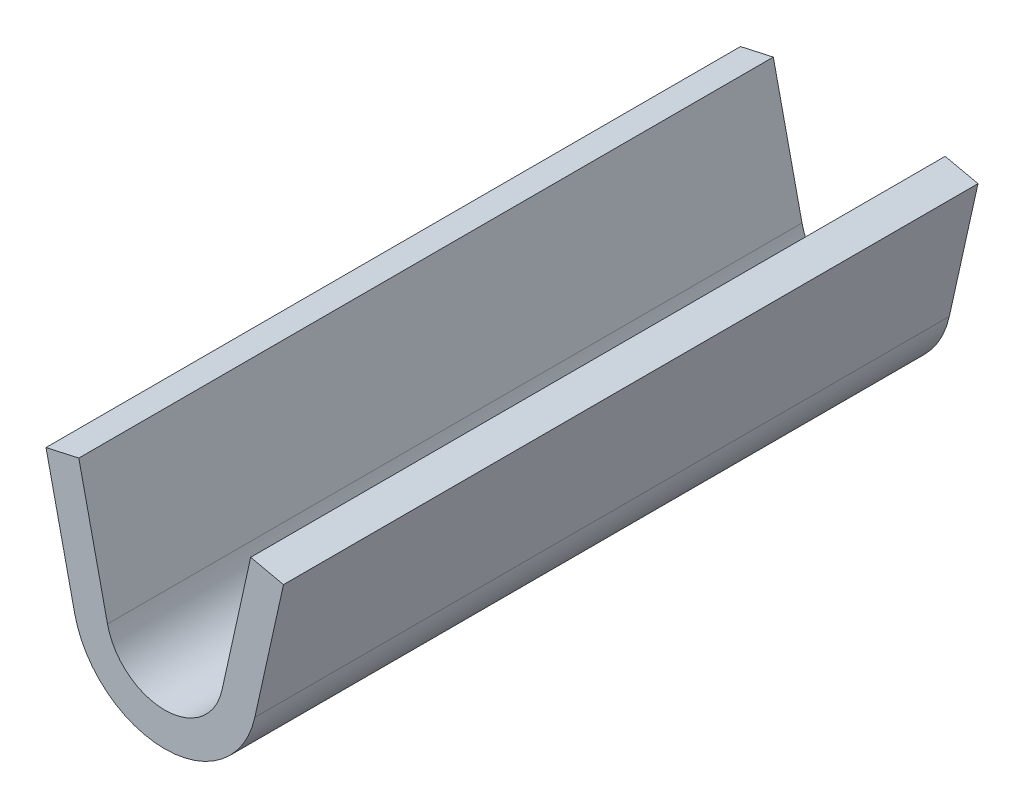
ISO-10303-21;
HEADER;
FILE_DESCRIPTION(('STEP AP214'),'2;1');
FILE_NAME('part.step','',(''),(''),'','','');
FILE_SCHEMA(('AUTOMOTIVE_DESIGN { 1 0 10303 214 1 1 1 1 }'));
ENDSEC;
DATA;
#1=APPLICATION_CONTEXT('core data for automotive mechanical design processes');
#2=APPLICATION_PROTOCOL_DEFINITION('international standard','automotive_design',2000,#1);
#3=PRODUCT_CONTEXT('',#1,'mechanical');
#4=PRODUCT('Part','Part','',(#3));
#5=PRODUCT_RELATED_PRODUCT_CATEGORY('part','',(#4));
#6=PRODUCT_DEFINITION_FORMATION('','',#4);
#7=PRODUCT_DEFINITION_CONTEXT('part definition',#1,'design');
#8=PRODUCT_DEFINITION('design','',#6,#7);
#9=PRODUCT_DEFINITION_SHAPE('','',#8);
#10=(LENGTH_UNIT() NAMED_UNIT(*) SI_UNIT(.MILLI.,.METRE.));
#11=(NAMED_UNIT(*) PLANE_ANGLE_UNIT() SI_UNIT($,.RADIAN.));
#12=(NAMED_UNIT(*) SI_UNIT($,.STERADIAN.) SOLID_ANGLE_UNIT());
#13=UNCERTAINTY_MEASURE_WITH_UNIT(LENGTH_MEASURE(1.E-05),#10,'distance_accuracy_value','');
#14=(GEOMETRIC_REPRESENTATION_CONTEXT(3) GLOBAL_UNCERTAINTY_ASSIGNED_CONTEXT((#13)) GLOBAL_UNIT_ASSIGNED_CONTEXT((#10,
#11,#12)) REPRESENTATION_CONTEXT('',''));
#15=CARTESIAN_POINT('',(0.,0.,0.));
#16=DIRECTION('',(0.,0.,1.));
#17=DIRECTION('',(1.,0.,0.));
#18=AXIS2_PLACEMENT_3D('',#15,#16,#17);
#19=CARTESIAN_POINT('',(-0.255558241465443,-0.0566558981273034,3.1));
#20=DIRECTION('',(-0.976296007119934,-0.216439613938099,0.));
#21=DIRECTION('',(0.216439613938099,-0.976296007119934,0.));
#22=AXIS2_PLACEMENT_3D('',#19,#20,#21);
#23=PLANE('',#22);
#24=DIRECTION('',(-0.216439613938099,0.976296007119934,0.));
#25=VECTOR('',#24,1.);
#26=CARTESIAN_POINT('',(-0.255558241465443,-0.0566558981273034,0.));
#27=LINE('',#26,#25);
#28=CARTESIAN_POINT('',(-0.255558241465443,-0.0566558981273034,0.));
#29=VERTEX_POINT('',#28);
#30=CARTESIAN_POINT('',(-0.38355559893201,0.520702870643421,0.));
#31=VERTEX_POINT('',#30);
#32=EDGE_CURVE('E131',#29,#31,#27,.T.);
#33=ORIENTED_EDGE('',*,*,#32,.T.);
#34=DIRECTION('',(0.,0.,-1.));
#35=VECTOR('',#34,1.);
#36=CARTESIAN_POINT('',(-0.38355559893201,0.520702870643421,3.1));
#37=LINE('',#36,#35);
#38=CARTESIAN_POINT('',(-0.38355559893201,0.520702870643421,3.1));
#39=VERTEX_POINT('',#38);
#40=EDGE_CURVE('E11',#39,#31,#37,.T.);
#41=ORIENTED_EDGE('',*,*,#40,.F.);
#42=DIRECTION('',(-0.216439613938099,0.976296007119934,0.));
#43=VECTOR('',#42,1.);
#44=CARTESIAN_POINT('',(-0.255558241465443,-0.0566558981273034,3.1));
#45=LINE('',#44,#43);
#46=CARTESIAN_POINT('',(-0.255558241465443,-0.0566558981273034,3.1));
#47=VERTEX_POINT('',#46);
#48=EDGE_CURVE('E89',#47,#39,#45,.T.);
#49=ORIENTED_EDGE('',*,*,#48,.F.);
#50=DIRECTION('',(0.,0.,-1.));
#51=VECTOR('',#50,1.);
#52=CARTESIAN_POINT('',(-0.255558241465443,-0.0566558981273034,3.1));
#53=LINE('',#52,#51);
#54=EDGE_CURVE('E130',#47,#29,#53,.T.);
#55=ORIENTED_EDGE('',*,*,#54,.T.);
#56=EDGE_LOOP('',(#33,#41,#49,#55));
#57=FACE_BOUND('',#56,.T.);
#58=ADVANCED_FACE('F34',(#57),#23,.F.);
#59=CARTESIAN_POINT('',(-0.53,0.488236928552706,3.1));
#60=DIRECTION('',(-0.216439613938099,0.976296007119934,0.));
#61=DIRECTION('',(-0.976296007119934,-0.216439613938099,0.));
#62=AXIS2_PLACEMENT_3D('',#59,#60,#61);
#63=PLANE('',#62);
#64=DIRECTION('',(0.976296007119934,0.216439613938099,0.));
#65=VECTOR('',#64,1.);
#66=CARTESIAN_POINT('',(-0.53,0.488236928552706,0.));
#67=LINE('',#66,#65);
#68=CARTESIAN_POINT('',(-0.53,0.488236928552706,0.));
#69=VERTEX_POINT('',#68);
#70=EDGE_CURVE('E134',#69,#31,#67,.T.);
#71=ORIENTED_EDGE('',*,*,#70,.F.);
#72=DIRECTION('',(0.,0.,-1.));
#73=VECTOR('',#72,1.);
#74=CARTESIAN_POINT('',(-0.53,0.488236928552706,3.1));
#75=LINE('',#74,#73);
#76=CARTESIAN_POINT('',(-0.53,0.488236928552706,3.1));
#77=VERTEX_POINT('',#76);
#78=EDGE_CURVE('E42',#77,#69,#75,.T.);
#79=ORIENTED_EDGE('',*,*,#78,.F.);
#80=DIRECTION('',(0.976296007119934,0.216439613938099,0.));
#81=VECTOR('',#80,1.);
#82=CARTESIAN_POINT('',(-0.53,0.488236928552706,3.1));
#83=LINE('',#82,#81);
#84=EDGE_CURVE('E173',#77,#39,#83,.T.);
#85=ORIENTED_EDGE('',*,*,#84,.T.);
#86=ORIENTED_EDGE('',*,*,#40,.T.);
#87=EDGE_LOOP('',(#71,#79,#85,#86));
#88=FACE_BOUND('',#87,.T.);
#89=ADVANCED_FACE('F164',(#88),#63,.T.);
#90=CARTESIAN_POINT('',(-0.402002642533433,-0.0891218402180183,3.1));
#91=DIRECTION('',(-0.976296007119934,-0.216439613938099,0.));
#92=DIRECTION('',(0.216439613938099,-0.976296007119934,0.));
#93=AXIS2_PLACEMENT_3D('',#90,#91,#92);
#94=PLANE('',#93);
#95=DIRECTION('',(-0.216439613938099,0.976296007119934,0.));
#96=VECTOR('',#95,1.);
#97=CARTESIAN_POINT('',(-0.402002642533433,-0.0891218402180183,0.));
#98=LINE('',#97,#96);
#99=CARTESIAN_POINT('',(-0.402002642533433,-0.0891218402180184,0.));
#100=VERTEX_POINT('',#99);
#101=EDGE_CURVE('E137',#100,#69,#98,.T.);
#102=ORIENTED_EDGE('',*,*,#101,.F.);
#103=DIRECTION('',(0.,0.,-1.));
#104=VECTOR('',#103,1.);
#105=CARTESIAN_POINT('',(-0.402002642533433,-0.0891218402180184,3.1));
#106=LINE('',#105,#104);
#107=CARTESIAN_POINT('',(-0.402002642533433,-0.0891218402180184,3.1));
#108=VERTEX_POINT('',#107);
#109=EDGE_CURVE('E154',#108,#100,#106,.T.);
#110=ORIENTED_EDGE('',*,*,#109,.F.);
#111=DIRECTION('',(-0.216439613938099,0.976296007119934,0.));
#112=VECTOR('',#111,1.);
#113=CARTESIAN_POINT('',(-0.402002642533433,-0.0891218402180183,3.1));
#114=LINE('',#113,#112);
#115=EDGE_CURVE('E161',#108,#77,#114,.T.);
#116=ORIENTED_EDGE('',*,*,#115,.T.);
#117=ORIENTED_EDGE('',*,*,#78,.T.);
#118=EDGE_LOOP('',(#102,#110,#116,#117));
#119=FACE_BOUND('',#118,.T.);
#120=ADVANCED_FACE('F159',(#119),#94,.T.);
#121=CARTESIAN_POINT('',(0.,0.,3.1));
#122=DIRECTION('',(0.,0.,-1.));
#123=DIRECTION('',(-1.,0.,0.));
#124=AXIS2_PLACEMENT_3D('',#121,#122,#123);
#125=CYLINDRICAL_SURFACE('',#124,0.411763071447294);
#126=CARTESIAN_POINT('',(0.,0.,0.));
#127=DIRECTION('',(0.,0.,-1.));
#128=DIRECTION('',(-1.,0.,0.));
#129=AXIS2_PLACEMENT_3D('',#126,#127,#128);
#130=CIRCLE('',#129,0.411763071447294);
#131=CARTESIAN_POINT('',(0.402002642533433,-0.0891218402180183,0.));
#132=VERTEX_POINT('',#131);
#133=EDGE_CURVE('E140',#132,#100,#130,.T.);
#134=ORIENTED_EDGE('',*,*,#133,.F.);
#135=DIRECTION('',(0.,0.,-1.));
#136=VECTOR('',#135,1.);
#137=CARTESIAN_POINT('',(0.402002642533433,-0.0891218402180183,3.1));
#138=LINE('',#137,#136);
#139=CARTESIAN_POINT('',(0.402002642533433,-0.0891218402180183,3.1));
#140=VERTEX_POINT('',#139);
#141=EDGE_CURVE('E152',#140,#132,#138,.T.);
#142=ORIENTED_EDGE('',*,*,#141,.F.);
#143=CARTESIAN_POINT('',(0.,0.,3.1));
#144=DIRECTION('',(0.,0.,-1.));
#145=DIRECTION('',(-1.,0.,0.));
#146=AXIS2_PLACEMENT_3D('',#143,#144,#145);
#147=CIRCLE('',#146,0.411763071447294);
#148=EDGE_CURVE('E125',#140,#108,#147,.T.);
#149=ORIENTED_EDGE('',*,*,#148,.T.);
#150=ORIENTED_EDGE('',*,*,#109,.T.);
#151=EDGE_LOOP('',(#134,#142,#149,#150));
#152=FACE_BOUND('',#151,.T.);
#153=ADVANCED_FACE('F171',(#152),#125,.T.);
#154=CARTESIAN_POINT('',(0.53,0.488236928552706,3.1));
#155=DIRECTION('',(0.976296007119934,-0.216439613938099,0.));
#156=DIRECTION('',(0.216439613938099,0.976296007119934,0.));
#157=AXIS2_PLACEMENT_3D('',#154,#155,#156);
#158=PLANE('',#157);
#159=DIRECTION('',(-0.216439613938099,-0.976296007119934,0.));
#160=VECTOR('',#159,1.);
#161=CARTESIAN_POINT('',(0.53,0.488236928552706,0.));
#162=LINE('',#161,#160);
#163=CARTESIAN_POINT('',(0.53,0.488236928552706,0.));
#164=VERTEX_POINT('',#163);
#165=EDGE_CURVE('E143',#164,#132,#162,.T.);
#166=ORIENTED_EDGE('',*,*,#165,.F.);
#167=DIRECTION('',(0.,0.,-1.));
#168=VECTOR('',#167,1.);
#169=CARTESIAN_POINT('',(0.53,0.488236928552706,3.1));
#170=LINE('',#169,#168);
#171=CARTESIAN_POINT('',(0.53,0.488236928552706,3.1));
#172=VERTEX_POINT('',#171);
#173=EDGE_CURVE('E113',#172,#164,#170,.T.);
#174=ORIENTED_EDGE('',*,*,#173,.F.);
#175=DIRECTION('',(-0.216439613938099,-0.976296007119934,0.));
#176=VECTOR('',#175,1.);
#177=CARTESIAN_POINT('',(0.53,0.488236928552706,3.1));
#178=LINE('',#177,#176);
#179=EDGE_CURVE('E123',#172,#140,#178,.T.);
#180=ORIENTED_EDGE('',*,*,#179,.T.);
#181=ORIENTED_EDGE('',*,*,#141,.T.);
#182=EDGE_LOOP('',(#166,#174,#180,#181));
#183=FACE_BOUND('',#182,.T.);
#184=ADVANCED_FACE('F178',(#183),#158,.T.);
#185=CARTESIAN_POINT('',(0.38355559893201,0.520702870643421,3.1));
#186=DIRECTION('',(0.216439613938099,0.976296007119934,0.));
#187=DIRECTION('',(-0.976296007119934,0.216439613938099,0.));
#188=AXIS2_PLACEMENT_3D('',#185,#186,#187);
#189=PLANE('',#188);
#190=DIRECTION('',(0.976296007119934,-0.216439613938099,0.));
#191=VECTOR('',#190,1.);
#192=CARTESIAN_POINT('',(0.38355559893201,0.520702870643421,0.));
#193=LINE('',#192,#191);
#194=CARTESIAN_POINT('',(0.38355559893201,0.520702870643421,0.));
#195=VERTEX_POINT('',#194);
#196=EDGE_CURVE('E112',#195,#164,#193,.T.);
#197=ORIENTED_EDGE('',*,*,#196,.F.);
#198=DIRECTION('',(0.,0.,-1.));
#199=VECTOR('',#198,1.);
#200=CARTESIAN_POINT('',(0.38355559893201,0.520702870643421,3.1));
#201=LINE('',#200,#199);
#202=CARTESIAN_POINT('',(0.38355559893201,0.520702870643421,3.1));
#203=VERTEX_POINT('',#202);
#204=EDGE_CURVE('E106',#203,#195,#201,.T.);
#205=ORIENTED_EDGE('',*,*,#204,.F.);
#206=DIRECTION('',(0.976296007119934,-0.216439613938099,0.));
#207=VECTOR('',#206,1.);
#208=CARTESIAN_POINT('',(0.38355559893201,0.520702870643421,3.1));
#209=LINE('',#208,#207);
#210=EDGE_CURVE('E110',#203,#172,#209,.T.);
#211=ORIENTED_EDGE('',*,*,#210,.T.);
#212=ORIENTED_EDGE('',*,*,#173,.T.);
#213=EDGE_LOOP('',(#197,#205,#211,#212));
#214=FACE_BOUND('',#213,.T.);
#215=ADVANCED_FACE('F108',(#214),#189,.T.);
#216=CARTESIAN_POINT('',(0.38355559893201,0.520702870643421,3.1));
#217=DIRECTION('',(0.976296007119934,-0.216439613938099,0.));
#218=DIRECTION('',(0.216439613938099,0.976296007119934,0.));
#219=AXIS2_PLACEMENT_3D('',#216,#217,#218);
#220=PLANE('',#219);
#221=DIRECTION('',(-0.216439613938099,-0.976296007119934,0.));
#222=VECTOR('',#221,1.);
#223=CARTESIAN_POINT('',(0.38355559893201,0.520702870643421,0.));
#224=LINE('',#223,#222);
#225=CARTESIAN_POINT('',(0.255558241465443,-0.0566558981273035,0.));
#226=VERTEX_POINT('',#225);
#227=EDGE_CURVE('E77',#195,#226,#224,.T.);
#228=ORIENTED_EDGE('',*,*,#227,.T.);
#229=DIRECTION('',(0.,0.,-1.));
#230=VECTOR('',#229,1.);
#231=CARTESIAN_POINT('',(0.255558241465443,-0.0566558981273035,3.1));
#232=LINE('',#231,#230);
#233=CARTESIAN_POINT('',(0.255558241465443,-0.0566558981273035,3.1));
#234=VERTEX_POINT('',#233);
#235=EDGE_CURVE('E114',#234,#226,#232,.T.);
#236=ORIENTED_EDGE('',*,*,#235,.F.);
#237=DIRECTION('',(-0.216439613938099,-0.976296007119934,0.));
#238=VECTOR('',#237,1.);
#239=CARTESIAN_POINT('',(0.38355559893201,0.520702870643421,3.1));
#240=LINE('',#239,#238);
#241=EDGE_CURVE('E116',#203,#234,#240,.T.);
#242=ORIENTED_EDGE('',*,*,#241,.F.);
#243=ORIENTED_EDGE('',*,*,#204,.T.);
#244=EDGE_LOOP('',(#228,#236,#242,#243));
#245=FACE_BOUND('',#244,.T.);
#246=ADVANCED_FACE('F117',(#245),#220,.F.);
#247=CARTESIAN_POINT('',(0.,0.,3.1));
#248=DIRECTION('',(0.,0.,-1.));
#249=DIRECTION('',(-1.,0.,0.));
#250=AXIS2_PLACEMENT_3D('',#247,#248,#249);
#251=CYLINDRICAL_SURFACE('',#250,0.261763071447294);
#252=CARTESIAN_POINT('',(0.,0.,0.));
#253=DIRECTION('',(0.,0.,1.));
#254=DIRECTION('',(1.,0.,0.));
#255=AXIS2_PLACEMENT_3D('',#252,#253,#254);
#256=CIRCLE('',#255,0.261763071447294);
#257=EDGE_CURVE('E83',#226,#29,#256,.F.);
#258=ORIENTED_EDGE('',*,*,#257,.T.);
#259=ORIENTED_EDGE('',*,*,#54,.F.);
#260=CARTESIAN_POINT('',(0.,0.,3.1));
#261=DIRECTION('',(0.,0.,1.));
#262=DIRECTION('',(1.,0.,0.));
#263=AXIS2_PLACEMENT_3D('',#260,#261,#262);
#264=CIRCLE('',#263,0.261763071447294);
#265=EDGE_CURVE('E50',#234,#47,#264,.F.);
#266=ORIENTED_EDGE('',*,*,#265,.F.);
#267=ORIENTED_EDGE('',*,*,#235,.T.);
#268=EDGE_LOOP('',(#258,#259,#266,#267));
#269=FACE_BOUND('',#268,.T.);
#270=ADVANCED_FACE('F180',(#269),#251,.F.);
#271=CARTESIAN_POINT('',(0.,0.,3.1));
#272=DIRECTION('',(0.,0.,-1.));
#273=DIRECTION('',(-1.,0.,0.));
#274=AXIS2_PLACEMENT_3D('',#271,#272,#273);
#275=PLANE('',#274);
#276=ORIENTED_EDGE('',*,*,#48,.T.);
#277=ORIENTED_EDGE('',*,*,#84,.F.);
#278=ORIENTED_EDGE('',*,*,#115,.F.);
#279=ORIENTED_EDGE('',*,*,#148,.F.);
#280=ORIENTED_EDGE('',*,*,#179,.F.);
#281=ORIENTED_EDGE('',*,*,#210,.F.);
#282=ORIENTED_EDGE('',*,*,#241,.T.);
#283=ORIENTED_EDGE('',*,*,#265,.T.);
#284=EDGE_LOOP('',(#276,#277,#278,#279,#280,#281,#282,#283));
#285=FACE_BOUND('',#284,.T.);
#286=ADVANCED_FACE('F120',(#285),#275,.F.);
#287=CARTESIAN_POINT('',(0.,0.,0.));
#288=DIRECTION('',(0.,0.,-1.));
#289=DIRECTION('',(-1.,0.,0.));
#290=AXIS2_PLACEMENT_3D('',#287,#288,#289);
#291=PLANE('',#290);
#292=ORIENTED_EDGE('',*,*,#32,.F.);
#293=ORIENTED_EDGE('',*,*,#257,.F.);
#294=ORIENTED_EDGE('',*,*,#227,.F.);
#295=ORIENTED_EDGE('',*,*,#196,.T.);
#296=ORIENTED_EDGE('',*,*,#165,.T.);
#297=ORIENTED_EDGE('',*,*,#133,.T.);
#298=ORIENTED_EDGE('',*,*,#101,.T.);
#299=ORIENTED_EDGE('',*,*,#70,.T.);
#300=EDGE_LOOP('',(#292,#293,#294,#295,#296,#297,#298,#299));
#301=FACE_BOUND('',#300,.T.);
#302=ADVANCED_FACE('F167',(#301),#291,.T.);
#303=CLOSED_SHELL('',(#58,#89,#120,#153,#184,#215,#246,#270,#286,#302));
#304=MANIFOLD_SOLID_BREP('B2',#303);
#305=ADVANCED_BREP_SHAPE_REPRESENTATION('',(#18,#304),#14);
#306=SHAPE_DEFINITION_REPRESENTATION(#9,#305);
ENDSEC;
END-ISO-10303-21;
